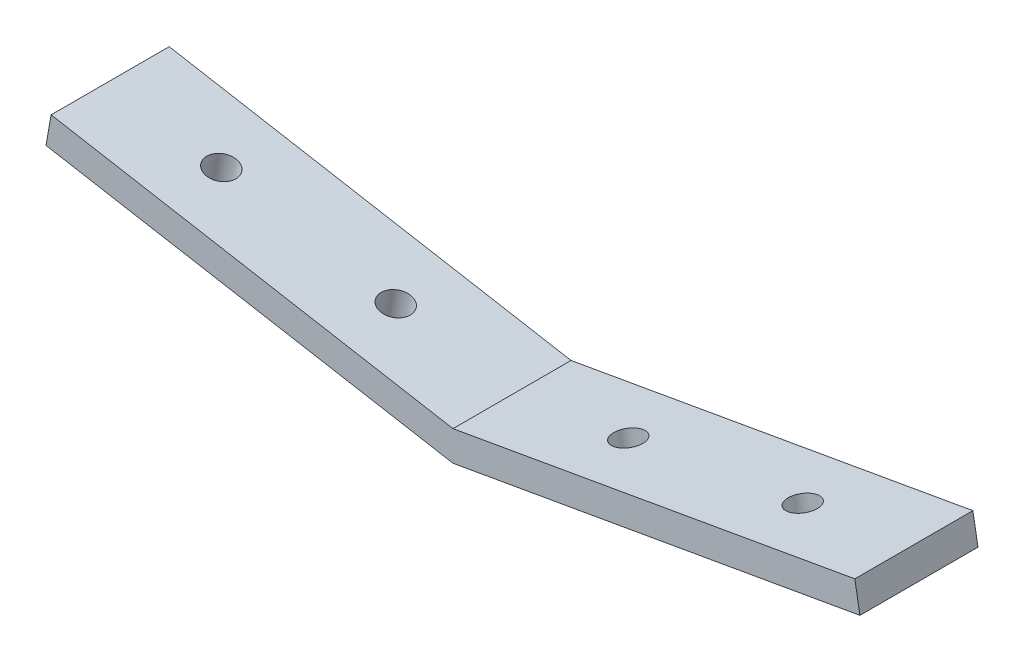
ISO-10303-21;
HEADER;
FILE_DESCRIPTION(('STEP AP214'),'2;1');
FILE_NAME('part.step','',(''),(''),'','','');
FILE_SCHEMA(('AUTOMOTIVE_DESIGN { 1 0 10303 214 1 1 1 1 }'));
ENDSEC;
DATA;
#1=APPLICATION_CONTEXT('core data for automotive mechanical design processes');
#2=APPLICATION_PROTOCOL_DEFINITION('international standard','automotive_design',2000,#1);
#3=PRODUCT_CONTEXT('',#1,'mechanical');
#4=PRODUCT('Part','Part','',(#3));
#5=PRODUCT_RELATED_PRODUCT_CATEGORY('part','',(#4));
#6=PRODUCT_DEFINITION_FORMATION('','',#4);
#7=PRODUCT_DEFINITION_CONTEXT('part definition',#1,'design');
#8=PRODUCT_DEFINITION('design','',#6,#7);
#9=PRODUCT_DEFINITION_SHAPE('','',#8);
#10=(LENGTH_UNIT() NAMED_UNIT(*) SI_UNIT(.MILLI.,.METRE.));
#11=(NAMED_UNIT(*) PLANE_ANGLE_UNIT() SI_UNIT($,.RADIAN.));
#12=(NAMED_UNIT(*) SI_UNIT($,.STERADIAN.) SOLID_ANGLE_UNIT());
#13=UNCERTAINTY_MEASURE_WITH_UNIT(LENGTH_MEASURE(1.E-05),#10,'distance_accuracy_value','');
#14=(GEOMETRIC_REPRESENTATION_CONTEXT(3) GLOBAL_UNCERTAINTY_ASSIGNED_CONTEXT((#13)) GLOBAL_UNIT_ASSIGNED_CONTEXT((#10,
#11,#12)) REPRESENTATION_CONTEXT('',''));
#15=CARTESIAN_POINT('',(0.,0.,0.));
#16=DIRECTION('',(0.,0.,1.));
#17=DIRECTION('',(1.,0.,0.));
#18=AXIS2_PLACEMENT_3D('',#15,#16,#17);
#19=CARTESIAN_POINT('',(-137.873085421709,24.3107448733703,40.));
#20=DIRECTION('',(0.984807753012208,-0.173648177666931,0.));
#21=DIRECTION('',(0.173648177666931,0.984807753012208,0.));
#22=AXIS2_PLACEMENT_3D('',#19,#20,#21);
#23=PLANE('',#22);
#24=DIRECTION('',(-0.173648177666931,-0.984807753012208,0.));
#25=VECTOR('',#24,1.);
#26=CARTESIAN_POINT('',(-137.873085421709,24.3107448733703,0.));
#27=LINE('',#26,#25);
#28=CARTESIAN_POINT('',(-136.13660364504,34.1588224034925,0.));
#29=VERTEX_POINT('',#28);
#30=CARTESIAN_POINT('',(-137.873085421709,24.3107448733703,0.));
#31=VERTEX_POINT('',#30);
#32=EDGE_CURVE('E132',#29,#31,#27,.T.);
#33=ORIENTED_EDGE('',*,*,#32,.T.);
#34=DIRECTION('',(0.,0.,-1.));
#35=VECTOR('',#34,1.);
#36=CARTESIAN_POINT('',(-137.873085421709,24.3107448733703,40.));
#37=LINE('',#36,#35);
#38=CARTESIAN_POINT('',(-137.873085421709,24.3107448733703,40.));
#39=VERTEX_POINT('',#38);
#40=EDGE_CURVE('E11',#39,#31,#37,.T.);
#41=ORIENTED_EDGE('',*,*,#40,.F.);
#42=DIRECTION('',(-0.173648177666931,-0.984807753012208,0.));
#43=VECTOR('',#42,1.);
#44=CARTESIAN_POINT('',(-137.873085421709,24.3107448733703,40.));
#45=LINE('',#44,#43);
#46=CARTESIAN_POINT('',(-136.13660364504,34.1588224034925,40.));
#47=VERTEX_POINT('',#46);
#48=EDGE_CURVE('E149',#47,#39,#45,.T.);
#49=ORIENTED_EDGE('',*,*,#48,.F.);
#50=DIRECTION('',(0.,0.,-1.));
#51=VECTOR('',#50,1.);
#52=CARTESIAN_POINT('',(-136.13660364504,34.1588224034925,40.));
#53=LINE('',#52,#51);
#54=EDGE_CURVE('E128',#47,#29,#53,.T.);
#55=ORIENTED_EDGE('',*,*,#54,.T.);
#56=EDGE_LOOP('',(#33,#41,#49,#55));
#57=FACE_BOUND('',#56,.T.);
#58=ADVANCED_FACE('F43',(#57),#23,.F.);
#59=CARTESIAN_POINT('',(0.,0.,40.));
#60=DIRECTION('',(0.173648177666931,0.984807753012208,0.));
#61=DIRECTION('',(-0.984807753012208,0.173648177666931,0.));
#62=AXIS2_PLACEMENT_3D('',#59,#60,#61);
#63=PLANE('',#62);
#64=CARTESIAN_POINT('',(-41.1287918971576,7.25211569541261,20.));
#65=DIRECTION('',(0.173648177666931,0.984807753012208,0.));
#66=DIRECTION('',(-0.984807753012208,0.173648177666931,0.));
#67=AXIS2_PLACEMENT_3D('',#64,#65,#66);
#68=CIRCLE('',#67,5.);
#69=CARTESIAN_POINT('',(-46.0528306622187,8.12035658374727,20.));
#70=VERTEX_POINT('',#69);
#71=EDGE_CURVE('E137',#70,#70,#68,.T.);
#72=ORIENTED_EDGE('',*,*,#71,.T.);
#73=EDGE_LOOP('',(#72));
#74=FACE_BOUND('',#73,.T.);
#75=CARTESIAN_POINT('',(-100.21725707789,17.6710063554285,20.));
#76=DIRECTION('',(0.173648177666931,0.984807753012208,0.));
#77=DIRECTION('',(-0.984807753012208,0.173648177666931,0.));
#78=AXIS2_PLACEMENT_3D('',#75,#76,#77);
#79=CIRCLE('',#78,4.99999999999999);
#80=CARTESIAN_POINT('',(-105.141295842951,18.5392472437631,20.));
#81=VERTEX_POINT('',#80);
#82=EDGE_CURVE('E287',#81,#81,#79,.T.);
#83=ORIENTED_EDGE('',*,*,#82,.T.);
#84=EDGE_LOOP('',(#83));
#85=FACE_BOUND('',#84,.T.);
#86=DIRECTION('',(0.984807753012208,-0.173648177666931,0.));
#87=VECTOR('',#86,1.);
#88=CARTESIAN_POINT('',(0.,0.,0.));
#89=LINE('',#88,#87);
#90=CARTESIAN_POINT('',(0.,0.,0.));
#91=VERTEX_POINT('',#90);
#92=EDGE_CURVE('E136',#31,#91,#89,.T.);
#93=ORIENTED_EDGE('',*,*,#92,.T.);
#94=DIRECTION('',(0.,0.,-1.));
#95=VECTOR('',#94,1.);
#96=CARTESIAN_POINT('',(0.,0.,40.));
#97=LINE('',#96,#95);
#98=CARTESIAN_POINT('',(0.,0.,40.));
#99=VERTEX_POINT('',#98);
#100=EDGE_CURVE('E52',#99,#91,#97,.T.);
#101=ORIENTED_EDGE('',*,*,#100,.F.);
#102=DIRECTION('',(0.984807753012208,-0.173648177666931,0.));
#103=VECTOR('',#102,1.);
#104=CARTESIAN_POINT('',(0.,0.,40.));
#105=LINE('',#104,#103);
#106=EDGE_CURVE('E97',#39,#99,#105,.T.);
#107=ORIENTED_EDGE('',*,*,#106,.F.);
#108=ORIENTED_EDGE('',*,*,#40,.T.);
#109=EDGE_LOOP('',(#93,#101,#107,#108));
#110=FACE_BOUND('',#109,.T.);
#111=ADVANCED_FACE('F183',(#74,#85,#110),#63,.F.);
#112=CARTESIAN_POINT('',(0.,0.,40.));
#113=DIRECTION('',(-0.173648177666931,0.984807753012208,0.));
#114=DIRECTION('',(-0.984807753012208,-0.173648177666931,0.));
#115=AXIS2_PLACEMENT_3D('',#112,#113,#114);
#116=PLANE('',#115);
#117=CARTESIAN_POINT('',(41.1287918971576,7.25211569541261,20.));
#118=DIRECTION('',(-0.173648177666931,0.984807753012208,0.));
#119=DIRECTION('',(-0.984807753012208,-0.173648177666931,0.));
#120=AXIS2_PLACEMENT_3D('',#117,#118,#119);
#121=CIRCLE('',#120,5.);
#122=CARTESIAN_POINT('',(36.2047531320966,6.38387480707796,20.));
#123=VERTEX_POINT('',#122);
#124=EDGE_CURVE('E271',#123,#123,#121,.F.);
#125=ORIENTED_EDGE('',*,*,#124,.F.);
#126=EDGE_LOOP('',(#125));
#127=FACE_BOUND('',#126,.T.);
#128=CARTESIAN_POINT('',(100.21725707789,17.6710063554285,20.));
#129=DIRECTION('',(-0.173648177666931,0.984807753012208,0.));
#130=DIRECTION('',(-0.984807753012208,-0.173648177666931,0.));
#131=AXIS2_PLACEMENT_3D('',#128,#129,#130);
#132=CIRCLE('',#131,4.99999999999999);
#133=CARTESIAN_POINT('',(95.2932183128291,16.8027654670938,20.));
#134=VERTEX_POINT('',#133);
#135=EDGE_CURVE('E274',#134,#134,#132,.F.);
#136=ORIENTED_EDGE('',*,*,#135,.F.);
#137=EDGE_LOOP('',(#136));
#138=FACE_BOUND('',#137,.T.);
#139=DIRECTION('',(0.984807753012208,0.173648177666931,0.));
#140=VECTOR('',#139,1.);
#141=CARTESIAN_POINT('',(0.,0.,0.));
#142=LINE('',#141,#140);
#143=CARTESIAN_POINT('',(137.873085421709,24.3107448733703,0.));
#144=VERTEX_POINT('',#143);
#145=EDGE_CURVE('E140',#91,#144,#142,.T.);
#146=ORIENTED_EDGE('',*,*,#145,.T.);
#147=DIRECTION('',(0.,0.,-1.));
#148=VECTOR('',#147,1.);
#149=CARTESIAN_POINT('',(137.873085421709,24.3107448733703,40.));
#150=LINE('',#149,#148);
#151=CARTESIAN_POINT('',(137.873085421709,24.3107448733703,40.));
#152=VERTEX_POINT('',#151);
#153=EDGE_CURVE('E121',#152,#144,#150,.T.);
#154=ORIENTED_EDGE('',*,*,#153,.F.);
#155=DIRECTION('',(0.984807753012208,0.173648177666931,0.));
#156=VECTOR('',#155,1.);
#157=CARTESIAN_POINT('',(0.,0.,40.));
#158=LINE('',#157,#156);
#159=EDGE_CURVE('E110',#99,#152,#158,.T.);
#160=ORIENTED_EDGE('',*,*,#159,.F.);
#161=ORIENTED_EDGE('',*,*,#100,.T.);
#162=EDGE_LOOP('',(#146,#154,#160,#161));
#163=FACE_BOUND('',#162,.T.);
#164=ADVANCED_FACE('F159',(#127,#138,#163),#116,.F.);
#165=CARTESIAN_POINT('',(137.873085421709,24.3107448733703,40.));
#166=DIRECTION('',(-0.984807753012208,-0.173648177666931,0.));
#167=DIRECTION('',(0.173648177666931,-0.984807753012208,0.));
#168=AXIS2_PLACEMENT_3D('',#165,#166,#167);
#169=PLANE('',#168);
#170=DIRECTION('',(-0.173648177666931,0.984807753012208,0.));
#171=VECTOR('',#170,1.);
#172=CARTESIAN_POINT('',(137.873085421709,24.3107448733703,0.));
#173=LINE('',#172,#171);
#174=CARTESIAN_POINT('',(136.13660364504,34.1588224034925,0.));
#175=VERTEX_POINT('',#174);
#176=EDGE_CURVE('E119',#144,#175,#173,.T.);
#177=ORIENTED_EDGE('',*,*,#176,.T.);
#178=DIRECTION('',(0.,0.,-1.));
#179=VECTOR('',#178,1.);
#180=CARTESIAN_POINT('',(136.13660364504,34.1588224034925,40.));
#181=LINE('',#180,#179);
#182=CARTESIAN_POINT('',(136.13660364504,34.1588224034925,40.));
#183=VERTEX_POINT('',#182);
#184=EDGE_CURVE('E116',#183,#175,#181,.T.);
#185=ORIENTED_EDGE('',*,*,#184,.F.);
#186=DIRECTION('',(-0.173648177666931,0.984807753012208,0.));
#187=VECTOR('',#186,1.);
#188=CARTESIAN_POINT('',(137.873085421709,24.3107448733703,40.));
#189=LINE('',#188,#187);
#190=EDGE_CURVE('E104',#152,#183,#189,.T.);
#191=ORIENTED_EDGE('',*,*,#190,.F.);
#192=ORIENTED_EDGE('',*,*,#153,.T.);
#193=EDGE_LOOP('',(#177,#185,#191,#192));
#194=FACE_BOUND('',#193,.T.);
#195=ADVANCED_FACE('F117',(#194),#169,.F.);
#196=CARTESIAN_POINT('',(136.13660364504,34.1588224034925,40.));
#197=DIRECTION('',(0.173648177666931,-0.984807753012208,0.));
#198=DIRECTION('',(0.984807753012208,0.173648177666931,0.));
#199=AXIS2_PLACEMENT_3D('',#196,#197,#198);
#200=PLANE('',#199);
#201=CARTESIAN_POINT('',(39.3923101204883,17.1001932255347,20.));
#202=DIRECTION('',(0.173648177666931,-0.984807753012208,0.));
#203=DIRECTION('',(0.984807753012208,0.173648177666931,0.));
#204=AXIS2_PLACEMENT_3D('',#201,#202,#203);
#205=CIRCLE('',#204,5.);
#206=CARTESIAN_POINT('',(44.3163488855494,17.9684341138694,20.));
#207=VERTEX_POINT('',#206);
#208=EDGE_CURVE('E268',#207,#207,#205,.T.);
#209=ORIENTED_EDGE('',*,*,#208,.T.);
#210=EDGE_LOOP('',(#209));
#211=FACE_BOUND('',#210,.T.);
#212=CARTESIAN_POINT('',(98.4807753012208,27.5190838855506,20.));
#213=DIRECTION('',(0.173648177666931,-0.984807753012208,0.));
#214=DIRECTION('',(0.984807753012208,0.173648177666931,0.));
#215=AXIS2_PLACEMENT_3D('',#212,#213,#214);
#216=CIRCLE('',#215,4.99999999999999);
#217=CARTESIAN_POINT('',(103.404814066282,28.3873247738853,20.));
#218=VERTEX_POINT('',#217);
#219=EDGE_CURVE('E302',#218,#218,#216,.T.);
#220=ORIENTED_EDGE('',*,*,#219,.T.);
#221=EDGE_LOOP('',(#220));
#222=FACE_BOUND('',#221,.T.);
#223=DIRECTION('',(-0.984807753012208,-0.173648177666931,0.));
#224=VECTOR('',#223,1.);
#225=CARTESIAN_POINT('',(136.13660364504,34.1588224034925,0.));
#226=LINE('',#225,#224);
#227=CARTESIAN_POINT('',(0.,10.1542661188575,0.));
#228=VERTEX_POINT('',#227);
#229=EDGE_CURVE('E83',#175,#228,#226,.T.);
#230=ORIENTED_EDGE('',*,*,#229,.T.);
#231=DIRECTION('',(0.,0.,-1.));
#232=VECTOR('',#231,1.);
#233=CARTESIAN_POINT('',(0.,10.1542661188575,40.));
#234=LINE('',#233,#232);
#235=CARTESIAN_POINT('',(0.,10.1542661188575,40.));
#236=VERTEX_POINT('',#235);
#237=EDGE_CURVE('E122',#236,#228,#234,.T.);
#238=ORIENTED_EDGE('',*,*,#237,.F.);
#239=DIRECTION('',(-0.984807753012208,-0.173648177666931,0.));
#240=VECTOR('',#239,1.);
#241=CARTESIAN_POINT('',(136.13660364504,34.1588224034925,40.));
#242=LINE('',#241,#240);
#243=EDGE_CURVE('E108',#183,#236,#242,.T.);
#244=ORIENTED_EDGE('',*,*,#243,.F.);
#245=ORIENTED_EDGE('',*,*,#184,.T.);
#246=EDGE_LOOP('',(#230,#238,#244,#245));
#247=FACE_BOUND('',#246,.T.);
#248=ADVANCED_FACE('F124',(#211,#222,#247),#200,.F.);
#249=CARTESIAN_POINT('',(-136.13660364504,34.1588224034925,40.));
#250=DIRECTION('',(-0.173648177666931,-0.984807753012208,0.));
#251=DIRECTION('',(0.984807753012208,-0.173648177666931,0.));
#252=AXIS2_PLACEMENT_3D('',#249,#250,#251);
#253=PLANE('',#252);
#254=CARTESIAN_POINT('',(-39.3923101204883,17.1001932255347,20.));
#255=DIRECTION('',(0.173648177666931,0.984807753012208,0.));
#256=DIRECTION('',(-0.984807753012208,0.173648177666931,0.));
#257=AXIS2_PLACEMENT_3D('',#254,#255,#256);
#258=CIRCLE('',#257,5.);
#259=CARTESIAN_POINT('',(-44.3163488855494,17.9684341138694,20.));
#260=VERTEX_POINT('',#259);
#261=EDGE_CURVE('E279',#260,#260,#258,.T.);
#262=ORIENTED_EDGE('',*,*,#261,.F.);
#263=EDGE_LOOP('',(#262));
#264=FACE_BOUND('',#263,.T.);
#265=CARTESIAN_POINT('',(-98.4807753012208,27.5190838855506,20.));
#266=DIRECTION('',(0.173648177666931,0.984807753012208,0.));
#267=DIRECTION('',(-0.984807753012208,0.173648177666931,0.));
#268=AXIS2_PLACEMENT_3D('',#265,#266,#267);
#269=CIRCLE('',#268,4.99999999999999);
#270=CARTESIAN_POINT('',(-103.404814066282,28.3873247738853,20.));
#271=VERTEX_POINT('',#270);
#272=EDGE_CURVE('E273',#271,#271,#269,.T.);
#273=ORIENTED_EDGE('',*,*,#272,.F.);
#274=EDGE_LOOP('',(#273));
#275=FACE_BOUND('',#274,.T.);
#276=DIRECTION('',(-0.984807753012208,0.173648177666931,0.));
#277=VECTOR('',#276,1.);
#278=CARTESIAN_POINT('',(-136.13660364504,34.1588224034925,0.));
#279=LINE('',#278,#277);
#280=EDGE_CURVE('E89',#228,#29,#279,.T.);
#281=ORIENTED_EDGE('',*,*,#280,.T.);
#282=ORIENTED_EDGE('',*,*,#54,.F.);
#283=DIRECTION('',(-0.984807753012208,0.173648177666931,0.));
#284=VECTOR('',#283,1.);
#285=CARTESIAN_POINT('',(-136.13660364504,34.1588224034925,40.));
#286=LINE('',#285,#284);
#287=EDGE_CURVE('E60',#236,#47,#286,.T.);
#288=ORIENTED_EDGE('',*,*,#287,.F.);
#289=ORIENTED_EDGE('',*,*,#237,.T.);
#290=EDGE_LOOP('',(#281,#282,#288,#289));
#291=FACE_BOUND('',#290,.T.);
#292=ADVANCED_FACE('F166',(#264,#275,#291),#253,.F.);
#293=CARTESIAN_POINT('',(0.,0.,40.));
#294=DIRECTION('',(0.,0.,-1.));
#295=DIRECTION('',(-1.,0.,0.));
#296=AXIS2_PLACEMENT_3D('',#293,#294,#295);
#297=PLANE('',#296);
#298=ORIENTED_EDGE('',*,*,#48,.T.);
#299=ORIENTED_EDGE('',*,*,#106,.T.);
#300=ORIENTED_EDGE('',*,*,#159,.T.);
#301=ORIENTED_EDGE('',*,*,#190,.T.);
#302=ORIENTED_EDGE('',*,*,#243,.T.);
#303=ORIENTED_EDGE('',*,*,#287,.T.);
#304=EDGE_LOOP('',(#298,#299,#300,#301,#302,#303));
#305=FACE_BOUND('',#304,.T.);
#306=ADVANCED_FACE('F106',(#305),#297,.F.);
#307=CARTESIAN_POINT('',(0.,0.,0.));
#308=DIRECTION('',(0.,0.,-1.));
#309=DIRECTION('',(-1.,0.,0.));
#310=AXIS2_PLACEMENT_3D('',#307,#308,#309);
#311=PLANE('',#310);
#312=ORIENTED_EDGE('',*,*,#32,.F.);
#313=ORIENTED_EDGE('',*,*,#280,.F.);
#314=ORIENTED_EDGE('',*,*,#229,.F.);
#315=ORIENTED_EDGE('',*,*,#176,.F.);
#316=ORIENTED_EDGE('',*,*,#145,.F.);
#317=ORIENTED_EDGE('',*,*,#92,.F.);
#318=EDGE_LOOP('',(#312,#313,#314,#315,#316,#317));
#319=FACE_BOUND('',#318,.T.);
#320=ADVANCED_FACE('F162',(#319),#311,.T.);
#321=CARTESIAN_POINT('',(-104.374639300862,-5.9066798629142,20.));
#322=DIRECTION('',(0.173648177666931,0.984807753012208,0.));
#323=DIRECTION('',(-0.984807753012208,0.173648177666931,0.));
#324=AXIS2_PLACEMENT_3D('',#321,#322,#323);
#325=CYLINDRICAL_SURFACE('',#324,4.99999999999999);
#326=ORIENTED_EDGE('',*,*,#272,.T.);
#327=EDGE_LOOP('',(#326));
#328=FACE_BOUND('',#327,.T.);
#329=ORIENTED_EDGE('',*,*,#82,.F.);
#330=EDGE_LOOP('',(#329));
#331=FACE_BOUND('',#330,.T.);
#332=ADVANCED_FACE('F222',(#328,#331),#325,.F.);
#333=CARTESIAN_POINT('',(-45.2861741201296,-16.3255705229301,20.));
#334=DIRECTION('',(0.173648177666931,0.984807753012208,0.));
#335=DIRECTION('',(-0.984807753012208,0.173648177666931,0.));
#336=AXIS2_PLACEMENT_3D('',#333,#334,#335);
#337=CYLINDRICAL_SURFACE('',#336,5.);
#338=ORIENTED_EDGE('',*,*,#261,.T.);
#339=EDGE_LOOP('',(#338));
#340=FACE_BOUND('',#339,.T.);
#341=ORIENTED_EDGE('',*,*,#71,.F.);
#342=EDGE_LOOP('',(#341));
#343=FACE_BOUND('',#342,.T.);
#344=ADVANCED_FACE('F227',(#340,#343),#337,.F.);
#345=CARTESIAN_POINT('',(104.374639300862,-5.9066798629142,20.));
#346=DIRECTION('',(-0.173648177666931,0.984807753012208,0.));
#347=DIRECTION('',(-0.984807753012208,-0.173648177666931,0.));
#348=AXIS2_PLACEMENT_3D('',#345,#346,#347);
#349=CYLINDRICAL_SURFACE('',#348,4.99999999999999);
#350=ORIENTED_EDGE('',*,*,#219,.F.);
#351=EDGE_LOOP('',(#350));
#352=FACE_BOUND('',#351,.T.);
#353=ORIENTED_EDGE('',*,*,#135,.T.);
#354=EDGE_LOOP('',(#353));
#355=FACE_BOUND('',#354,.T.);
#356=ADVANCED_FACE('F235',(#352,#355),#349,.F.);
#357=CARTESIAN_POINT('',(45.2861741201296,-16.3255705229301,20.));
#358=DIRECTION('',(-0.173648177666931,0.984807753012208,0.));
#359=DIRECTION('',(-0.984807753012208,-0.173648177666931,0.));
#360=AXIS2_PLACEMENT_3D('',#357,#358,#359);
#361=CYLINDRICAL_SURFACE('',#360,5.);
#362=ORIENTED_EDGE('',*,*,#208,.F.);
#363=EDGE_LOOP('',(#362));
#364=FACE_BOUND('',#363,.T.);
#365=ORIENTED_EDGE('',*,*,#124,.T.);
#366=EDGE_LOOP('',(#365));
#367=FACE_BOUND('',#366,.T.);
#368=ADVANCED_FACE('F242',(#364,#367),#361,.F.);
#369=CLOSED_SHELL('',(#58,#111,#164,#195,#248,#292,#306,#320,#332,#344,#356,#368));
#370=MANIFOLD_SOLID_BREP('B2',#369);
#371=ADVANCED_BREP_SHAPE_REPRESENTATION('',(#18,#370),#14);
#372=SHAPE_DEFINITION_REPRESENTATION(#9,#371);
ENDSEC;
END-ISO-10303-21;
